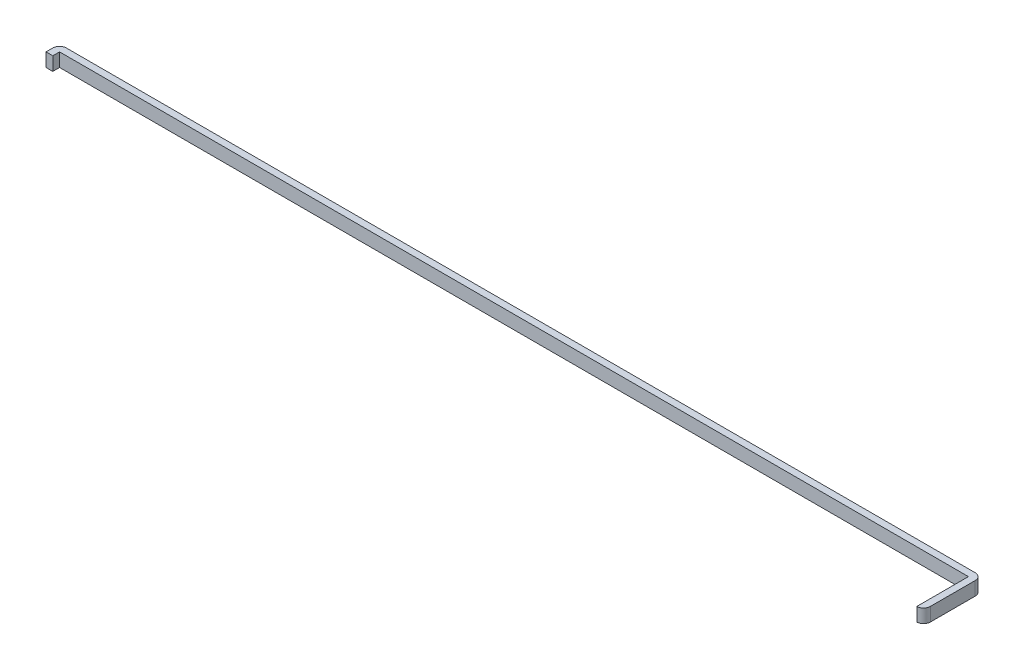
ISO-10303-21;
HEADER;
FILE_DESCRIPTION(('STEP AP214'),'2;1');
FILE_NAME('part.step','',(''),(''),'','','');
FILE_SCHEMA(('AUTOMOTIVE_DESIGN { 1 0 10303 214 1 1 1 1 }'));
ENDSEC;
DATA;
#1=APPLICATION_CONTEXT('core data for automotive mechanical design processes');
#2=APPLICATION_PROTOCOL_DEFINITION('international standard','automotive_design',2000,#1);
#3=PRODUCT_CONTEXT('',#1,'mechanical');
#4=PRODUCT('Part','Part','',(#3));
#5=PRODUCT_RELATED_PRODUCT_CATEGORY('part','',(#4));
#6=PRODUCT_DEFINITION_FORMATION('','',#4);
#7=PRODUCT_DEFINITION_CONTEXT('part definition',#1,'design');
#8=PRODUCT_DEFINITION('design','',#6,#7);
#9=PRODUCT_DEFINITION_SHAPE('','',#8);
#10=(LENGTH_UNIT() NAMED_UNIT(*) SI_UNIT(.MILLI.,.METRE.));
#11=(NAMED_UNIT(*) PLANE_ANGLE_UNIT() SI_UNIT($,.RADIAN.));
#12=(NAMED_UNIT(*) SI_UNIT($,.STERADIAN.) SOLID_ANGLE_UNIT());
#13=UNCERTAINTY_MEASURE_WITH_UNIT(LENGTH_MEASURE(1.E-05),#10,'distance_accuracy_value','');
#14=(GEOMETRIC_REPRESENTATION_CONTEXT(3) GLOBAL_UNCERTAINTY_ASSIGNED_CONTEXT((#13)) GLOBAL_UNIT_ASSIGNED_CONTEXT((#10,
#11,#12)) REPRESENTATION_CONTEXT('',''));
#15=CARTESIAN_POINT('',(0.,0.,0.));
#16=DIRECTION('',(0.,0.,1.));
#17=DIRECTION('',(1.,0.,0.));
#18=AXIS2_PLACEMENT_3D('',#15,#16,#17);
#19=CARTESIAN_POINT('',(-13.425,0.59381,0.20019));
#20=DIRECTION('',(0.,0.,-1.));
#21=DIRECTION('',(-1.,0.,0.));
#22=AXIS2_PLACEMENT_3D('',#19,#20,#21);
#23=PLANE('',#22);
#24=DIRECTION('',(0.,1.,0.));
#25=VECTOR('',#24,1.);
#26=CARTESIAN_POINT('',(13.435,0.59381,0.20019));
#27=LINE('',#26,#25);
#28=CARTESIAN_POINT('',(13.435,0.59381,0.20019));
#29=VERTEX_POINT('',#28);
#30=CARTESIAN_POINT('',(13.435,0.99419,0.20019));
#31=VERTEX_POINT('',#30);
#32=EDGE_CURVE('E125',#29,#31,#27,.T.);
#33=ORIENTED_EDGE('',*,*,#32,.T.);
#34=DIRECTION('',(1.,0.,0.));
#35=VECTOR('',#34,1.);
#36=CARTESIAN_POINT('',(13.435,0.99419,0.20019));
#37=LINE('',#36,#35);
#38=CARTESIAN_POINT('',(-13.425,0.99419,0.20019));
#39=VERTEX_POINT('',#38);
#40=EDGE_CURVE('E112',#31,#39,#37,.F.);
#41=ORIENTED_EDGE('',*,*,#40,.T.);
#42=DIRECTION('',(0.,1.,0.));
#43=VECTOR('',#42,1.);
#44=CARTESIAN_POINT('',(-13.425,0.59381,0.20019));
#45=LINE('',#44,#43);
#46=CARTESIAN_POINT('',(-13.425,0.59381,0.20019));
#47=VERTEX_POINT('',#46);
#48=EDGE_CURVE('E108',#39,#47,#45,.F.);
#49=ORIENTED_EDGE('',*,*,#48,.T.);
#50=DIRECTION('',(1.,0.,0.));
#51=VECTOR('',#50,1.);
#52=CARTESIAN_POINT('',(13.435,0.59381,0.20019));
#53=LINE('',#52,#51);
#54=EDGE_CURVE('E126',#29,#47,#53,.F.);
#55=ORIENTED_EDGE('',*,*,#54,.F.);
#56=EDGE_LOOP('',(#33,#41,#49,#55));
#57=FACE_BOUND('',#56,.T.);
#58=ADVANCED_FACE('F17',(#57),#23,.F.);
#59=CARTESIAN_POINT('',(-13.425,0.59381,0.40038));
#60=DIRECTION('',(-1.,0.,0.));
#61=DIRECTION('',(0.,0.,1.));
#62=AXIS2_PLACEMENT_3D('',#59,#60,#61);
#63=PLANE('',#62);
#64=ORIENTED_EDGE('',*,*,#48,.F.);
#65=DIRECTION('',(0.,0.,-1.));
#66=VECTOR('',#65,1.);
#67=CARTESIAN_POINT('',(-13.425,0.99419,0.20019));
#68=LINE('',#67,#66);
#69=CARTESIAN_POINT('',(-13.425,0.99419,0.40038));
#70=VERTEX_POINT('',#69);
#71=EDGE_CURVE('E120',#39,#70,#68,.F.);
#72=ORIENTED_EDGE('',*,*,#71,.T.);
#73=DIRECTION('',(0.,1.,0.));
#74=VECTOR('',#73,1.);
#75=CARTESIAN_POINT('',(-13.425,0.59381,0.40038));
#76=LINE('',#75,#74);
#77=CARTESIAN_POINT('',(-13.425,0.59381,0.40038));
#78=VERTEX_POINT('',#77);
#79=EDGE_CURVE('E177',#70,#78,#76,.F.);
#80=ORIENTED_EDGE('',*,*,#79,.T.);
#81=DIRECTION('',(0.,0.,-1.));
#82=VECTOR('',#81,1.);
#83=CARTESIAN_POINT('',(-13.425,0.59381,0.20019));
#84=LINE('',#83,#82);
#85=EDGE_CURVE('E168',#47,#78,#84,.F.);
#86=ORIENTED_EDGE('',*,*,#85,.F.);
#87=EDGE_LOOP('',(#64,#72,#80,#86));
#88=FACE_BOUND('',#87,.T.);
#89=ADVANCED_FACE('F227',(#88),#63,.F.);
#90=CARTESIAN_POINT('',(-13.62519,0.59381,0.40038));
#91=DIRECTION('',(0.,0.,-1.));
#92=DIRECTION('',(-1.,0.,0.));
#93=AXIS2_PLACEMENT_3D('',#90,#91,#92);
#94=PLANE('',#93);
#95=ORIENTED_EDGE('',*,*,#79,.F.);
#96=DIRECTION('',(1.,0.,0.));
#97=VECTOR('',#96,1.);
#98=CARTESIAN_POINT('',(13.435,0.99419,0.40038));
#99=LINE('',#98,#97);
#100=CARTESIAN_POINT('',(-13.62519,0.99419,0.40038));
#101=VERTEX_POINT('',#100);
#102=EDGE_CURVE('E145',#70,#101,#99,.F.);
#103=ORIENTED_EDGE('',*,*,#102,.T.);
#104=DIRECTION('',(0.,1.,0.));
#105=VECTOR('',#104,1.);
#106=CARTESIAN_POINT('',(-13.62519,0.59381,0.40038));
#107=LINE('',#106,#105);
#108=CARTESIAN_POINT('',(-13.62519,0.59381,0.40038));
#109=VERTEX_POINT('',#108);
#110=EDGE_CURVE('E184',#101,#109,#107,.F.);
#111=ORIENTED_EDGE('',*,*,#110,.T.);
#112=DIRECTION('',(1.,0.,0.));
#113=VECTOR('',#112,1.);
#114=CARTESIAN_POINT('',(13.435,0.59381,0.40038));
#115=LINE('',#114,#113);
#116=EDGE_CURVE('E86',#78,#109,#115,.F.);
#117=ORIENTED_EDGE('',*,*,#116,.F.);
#118=EDGE_LOOP('',(#95,#103,#111,#117));
#119=FACE_BOUND('',#118,.T.);
#120=ADVANCED_FACE('F226',(#119),#94,.F.);
#121=CARTESIAN_POINT('',(-13.62519,0.59381,0.20019));
#122=DIRECTION('',(1.,0.,0.));
#123=DIRECTION('',(0.,0.,-1.));
#124=AXIS2_PLACEMENT_3D('',#121,#122,#123);
#125=PLANE('',#124);
#126=ORIENTED_EDGE('',*,*,#110,.F.);
#127=DIRECTION('',(0.,0.,-1.));
#128=VECTOR('',#127,1.);
#129=CARTESIAN_POINT('',(-13.62519,0.99419,0.20019));
#130=LINE('',#129,#128);
#131=CARTESIAN_POINT('',(-13.62519,0.99419,0.20019));
#132=VERTEX_POINT('',#131);
#133=EDGE_CURVE('E148',#101,#132,#130,.T.);
#134=ORIENTED_EDGE('',*,*,#133,.T.);
#135=DIRECTION('',(0.,-1.,0.));
#136=VECTOR('',#135,1.);
#137=CARTESIAN_POINT('',(-13.62519,0.59381,0.20019));
#138=LINE('',#137,#136);
#139=CARTESIAN_POINT('',(-13.62519,0.59381,0.20019));
#140=VERTEX_POINT('',#139);
#141=EDGE_CURVE('E134',#140,#132,#138,.F.);
#142=ORIENTED_EDGE('',*,*,#141,.F.);
#143=DIRECTION('',(0.,0.,-1.));
#144=VECTOR('',#143,1.);
#145=CARTESIAN_POINT('',(-13.62519,0.59381,0.20019));
#146=LINE('',#145,#144);
#147=EDGE_CURVE('E80',#109,#140,#146,.T.);
#148=ORIENTED_EDGE('',*,*,#147,.F.);
#149=EDGE_LOOP('',(#126,#134,#142,#148));
#150=FACE_BOUND('',#149,.T.);
#151=ADVANCED_FACE('F224',(#150),#125,.F.);
#152=CARTESIAN_POINT('',(13.63519,0.59381,1.524905));
#153=DIRECTION('',(-1.,0.,0.));
#154=DIRECTION('',(0.,0.,1.));
#155=AXIS2_PLACEMENT_3D('',#152,#153,#154);
#156=PLANE('',#155);
#157=DIRECTION('',(0.,-1.,0.));
#158=VECTOR('',#157,1.);
#159=CARTESIAN_POINT('',(13.63519,0.59381,0.20019));
#160=LINE('',#159,#158);
#161=CARTESIAN_POINT('',(13.63519,0.99419,0.20019));
#162=VERTEX_POINT('',#161);
#163=CARTESIAN_POINT('',(13.63519,0.59381,0.20019));
#164=VERTEX_POINT('',#163);
#165=EDGE_CURVE('E74',#162,#164,#160,.T.);
#166=ORIENTED_EDGE('',*,*,#165,.F.);
#167=DIRECTION('',(0.,0.,-1.));
#168=VECTOR('',#167,1.);
#169=CARTESIAN_POINT('',(13.63519,0.99419,0.20019));
#170=LINE('',#169,#168);
#171=CARTESIAN_POINT('',(13.63519,0.99419,1.524905));
#172=VERTEX_POINT('',#171);
#173=EDGE_CURVE('E139',#162,#172,#170,.F.);
#174=ORIENTED_EDGE('',*,*,#173,.T.);
#175=DIRECTION('',(0.,-1.,0.));
#176=VECTOR('',#175,1.);
#177=CARTESIAN_POINT('',(13.63519,0.59381,1.524905));
#178=LINE('',#177,#176);
#179=CARTESIAN_POINT('',(13.63519,0.59381,1.524905));
#180=VERTEX_POINT('',#179);
#181=EDGE_CURVE('E190',#180,#172,#178,.F.);
#182=ORIENTED_EDGE('',*,*,#181,.F.);
#183=DIRECTION('',(0.,0.,-1.));
#184=VECTOR('',#183,1.);
#185=CARTESIAN_POINT('',(13.63519,0.59381,0.20019));
#186=LINE('',#185,#184);
#187=EDGE_CURVE('E160',#164,#180,#186,.F.);
#188=ORIENTED_EDGE('',*,*,#187,.F.);
#189=EDGE_LOOP('',(#166,#174,#182,#188));
#190=FACE_BOUND('',#189,.T.);
#191=ADVANCED_FACE('F216',(#190),#156,.F.);
#192=CARTESIAN_POINT('',(13.435,0.59381,1.524905));
#193=DIRECTION('',(0.,-1.,0.));
#194=DIRECTION('',(0.,0.,-1.));
#195=AXIS2_PLACEMENT_3D('',#192,#193,#194);
#196=CYLINDRICAL_SURFACE('',#195,0.20019);
#197=CARTESIAN_POINT('',(13.435,0.99419,1.524905));
#198=DIRECTION('',(0.,-1.,0.));
#199=DIRECTION('',(0.,0.,-1.));
#200=AXIS2_PLACEMENT_3D('',#197,#198,#199);
#201=CIRCLE('',#200,0.20019);
#202=CARTESIAN_POINT('',(13.435,0.99419,1.725095));
#203=VERTEX_POINT('',#202);
#204=EDGE_CURVE('E135',#172,#203,#201,.T.);
#205=ORIENTED_EDGE('',*,*,#204,.T.);
#206=DIRECTION('',(0.,1.,0.));
#207=VECTOR('',#206,1.);
#208=CARTESIAN_POINT('',(13.435,0.59381,1.725095));
#209=LINE('',#208,#207);
#210=CARTESIAN_POINT('',(13.435,0.59381,1.725095));
#211=VERTEX_POINT('',#210);
#212=EDGE_CURVE('E129',#203,#211,#209,.F.);
#213=ORIENTED_EDGE('',*,*,#212,.T.);
#214=CARTESIAN_POINT('',(13.435,0.59381,1.524905));
#215=DIRECTION('',(0.,-1.,0.));
#216=DIRECTION('',(0.,0.,-1.));
#217=AXIS2_PLACEMENT_3D('',#214,#215,#216);
#218=CIRCLE('',#217,0.20019);
#219=EDGE_CURVE('E156',#180,#211,#218,.T.);
#220=ORIENTED_EDGE('',*,*,#219,.F.);
#221=ORIENTED_EDGE('',*,*,#181,.T.);
#222=EDGE_LOOP('',(#205,#213,#220,#221));
#223=FACE_BOUND('',#222,.T.);
#224=ADVANCED_FACE('F218',(#223),#196,.T.);
#225=CARTESIAN_POINT('',(13.435,0.59381,0.20019));
#226=DIRECTION('',(1.,0.,0.));
#227=DIRECTION('',(0.,0.,-1.));
#228=AXIS2_PLACEMENT_3D('',#225,#226,#227);
#229=PLANE('',#228);
#230=DIRECTION('',(0.,0.,-1.));
#231=VECTOR('',#230,1.);
#232=CARTESIAN_POINT('',(13.435,0.59381,0.20019));
#233=LINE('',#232,#231);
#234=EDGE_CURVE('E159',#211,#29,#233,.T.);
#235=ORIENTED_EDGE('',*,*,#234,.F.);
#236=ORIENTED_EDGE('',*,*,#212,.F.);
#237=DIRECTION('',(0.,0.,-1.));
#238=VECTOR('',#237,1.);
#239=CARTESIAN_POINT('',(13.435,0.99419,0.20019));
#240=LINE('',#239,#238);
#241=EDGE_CURVE('E117',#203,#31,#240,.T.);
#242=ORIENTED_EDGE('',*,*,#241,.T.);
#243=ORIENTED_EDGE('',*,*,#32,.F.);
#244=EDGE_LOOP('',(#235,#236,#242,#243));
#245=FACE_BOUND('',#244,.T.);
#246=ADVANCED_FACE('F131',(#245),#229,.F.);
#247=CARTESIAN_POINT('',(13.435,0.59381,0.20019));
#248=DIRECTION('',(0.,-1.,0.));
#249=DIRECTION('',(0.,0.,-1.));
#250=AXIS2_PLACEMENT_3D('',#247,#248,#249);
#251=CYLINDRICAL_SURFACE('',#250,0.20019);
#252=CARTESIAN_POINT('',(13.435,0.99419,0.20019));
#253=DIRECTION('',(0.,-1.,0.));
#254=DIRECTION('',(0.,0.,-1.));
#255=AXIS2_PLACEMENT_3D('',#252,#253,#254);
#256=CIRCLE('',#255,0.20019);
#257=CARTESIAN_POINT('',(13.435,0.99419,0.));
#258=VERTEX_POINT('',#257);
#259=EDGE_CURVE('E20',#258,#162,#256,.T.);
#260=ORIENTED_EDGE('',*,*,#259,.T.);
#261=ORIENTED_EDGE('',*,*,#165,.T.);
#262=CARTESIAN_POINT('',(13.435,0.59381,0.20019));
#263=DIRECTION('',(0.,-1.,0.));
#264=DIRECTION('',(0.,0.,-1.));
#265=AXIS2_PLACEMENT_3D('',#262,#263,#264);
#266=CIRCLE('',#265,0.20019);
#267=CARTESIAN_POINT('',(13.435,0.59381,0.));
#268=VERTEX_POINT('',#267);
#269=EDGE_CURVE('E161',#268,#164,#266,.T.);
#270=ORIENTED_EDGE('',*,*,#269,.F.);
#271=DIRECTION('',(0.,1.,0.));
#272=VECTOR('',#271,1.);
#273=CARTESIAN_POINT('',(13.435,0.59381,0.));
#274=LINE('',#273,#272);
#275=EDGE_CURVE('E64',#268,#258,#274,.T.);
#276=ORIENTED_EDGE('',*,*,#275,.T.);
#277=EDGE_LOOP('',(#260,#261,#270,#276));
#278=FACE_BOUND('',#277,.T.);
#279=ADVANCED_FACE('F219',(#278),#251,.T.);
#280=CARTESIAN_POINT('',(13.435,0.99419,0.20019));
#281=DIRECTION('',(0.,-1.,0.));
#282=DIRECTION('',(0.,0.,-1.));
#283=AXIS2_PLACEMENT_3D('',#280,#281,#282);
#284=PLANE('',#283);
#285=ORIENTED_EDGE('',*,*,#241,.F.);
#286=ORIENTED_EDGE('',*,*,#204,.F.);
#287=ORIENTED_EDGE('',*,*,#173,.F.);
#288=ORIENTED_EDGE('',*,*,#259,.F.);
#289=DIRECTION('',(1.,0.,0.));
#290=VECTOR('',#289,1.);
#291=CARTESIAN_POINT('',(13.435,0.99419,0.));
#292=LINE('',#291,#290);
#293=CARTESIAN_POINT('',(-13.425,0.99419,0.));
#294=VERTEX_POINT('',#293);
#295=EDGE_CURVE('E204',#258,#294,#292,.F.);
#296=ORIENTED_EDGE('',*,*,#295,.T.);
#297=CARTESIAN_POINT('',(-13.425,0.99419,0.20019));
#298=DIRECTION('',(0.,-1.,0.));
#299=DIRECTION('',(0.,0.,-1.));
#300=AXIS2_PLACEMENT_3D('',#297,#298,#299);
#301=CIRCLE('',#300,0.20019);
#302=EDGE_CURVE('E137',#132,#294,#301,.T.);
#303=ORIENTED_EDGE('',*,*,#302,.F.);
#304=ORIENTED_EDGE('',*,*,#133,.F.);
#305=ORIENTED_EDGE('',*,*,#102,.F.);
#306=ORIENTED_EDGE('',*,*,#71,.F.);
#307=ORIENTED_EDGE('',*,*,#40,.F.);
#308=EDGE_LOOP('',(#285,#286,#287,#288,#296,#303,#304,#305,#306,#307));
#309=FACE_BOUND('',#308,.T.);
#310=ADVANCED_FACE('F114',(#309),#284,.F.);
#311=CARTESIAN_POINT('',(-13.425,0.59381,0.20019));
#312=DIRECTION('',(0.,-1.,0.));
#313=DIRECTION('',(0.,0.,-1.));
#314=AXIS2_PLACEMENT_3D('',#311,#312,#313);
#315=CYLINDRICAL_SURFACE('',#314,0.20019);
#316=ORIENTED_EDGE('',*,*,#302,.T.);
#317=DIRECTION('',(0.,1.,0.));
#318=VECTOR('',#317,1.);
#319=CARTESIAN_POINT('',(-13.425,0.59381,0.));
#320=LINE('',#319,#318);
#321=CARTESIAN_POINT('',(-13.425,0.59381,0.));
#322=VERTEX_POINT('',#321);
#323=EDGE_CURVE('E26',#294,#322,#320,.F.);
#324=ORIENTED_EDGE('',*,*,#323,.T.);
#325=CARTESIAN_POINT('',(-13.425,0.59381,0.20019));
#326=DIRECTION('',(0.,-1.,0.));
#327=DIRECTION('',(0.,0.,-1.));
#328=AXIS2_PLACEMENT_3D('',#325,#326,#327);
#329=CIRCLE('',#328,0.20019);
#330=EDGE_CURVE('E34',#140,#322,#329,.T.);
#331=ORIENTED_EDGE('',*,*,#330,.F.);
#332=ORIENTED_EDGE('',*,*,#141,.T.);
#333=EDGE_LOOP('',(#316,#324,#331,#332));
#334=FACE_BOUND('',#333,.T.);
#335=ADVANCED_FACE('F221',(#334),#315,.T.);
#336=CARTESIAN_POINT('',(13.435,0.59381,0.20019));
#337=DIRECTION('',(0.,-1.,0.));
#338=DIRECTION('',(0.,0.,-1.));
#339=AXIS2_PLACEMENT_3D('',#336,#337,#338);
#340=PLANE('',#339);
#341=ORIENTED_EDGE('',*,*,#219,.T.);
#342=ORIENTED_EDGE('',*,*,#234,.T.);
#343=ORIENTED_EDGE('',*,*,#54,.T.);
#344=ORIENTED_EDGE('',*,*,#85,.T.);
#345=ORIENTED_EDGE('',*,*,#116,.T.);
#346=ORIENTED_EDGE('',*,*,#147,.T.);
#347=ORIENTED_EDGE('',*,*,#330,.T.);
#348=DIRECTION('',(1.,0.,0.));
#349=VECTOR('',#348,1.);
#350=CARTESIAN_POINT('',(13.435,0.59381,0.));
#351=LINE('',#350,#349);
#352=EDGE_CURVE('E11',#322,#268,#351,.T.);
#353=ORIENTED_EDGE('',*,*,#352,.T.);
#354=ORIENTED_EDGE('',*,*,#269,.T.);
#355=ORIENTED_EDGE('',*,*,#187,.T.);
#356=EDGE_LOOP('',(#341,#342,#343,#344,#345,#346,#347,#353,#354,#355));
#357=FACE_BOUND('',#356,.T.);
#358=ADVANCED_FACE('F213',(#357),#340,.T.);
#359=CARTESIAN_POINT('',(13.435,0.59381,0.));
#360=DIRECTION('',(0.,0.,1.));
#361=DIRECTION('',(1.,0.,0.));
#362=AXIS2_PLACEMENT_3D('',#359,#360,#361);
#363=PLANE('',#362);
#364=ORIENTED_EDGE('',*,*,#323,.F.);
#365=ORIENTED_EDGE('',*,*,#295,.F.);
#366=ORIENTED_EDGE('',*,*,#275,.F.);
#367=ORIENTED_EDGE('',*,*,#352,.F.);
#368=EDGE_LOOP('',(#364,#365,#366,#367));
#369=FACE_BOUND('',#368,.T.);
#370=ADVANCED_FACE('F220',(#369),#363,.F.);
#371=CLOSED_SHELL('',(#58,#89,#120,#151,#191,#224,#246,#279,#310,#335,#358,#370));
#372=MANIFOLD_SOLID_BREP('B1',#371);
#373=ADVANCED_BREP_SHAPE_REPRESENTATION('',(#18,#372),#14);
#374=SHAPE_DEFINITION_REPRESENTATION(#9,#373);
ENDSEC;
END-ISO-10303-21;
